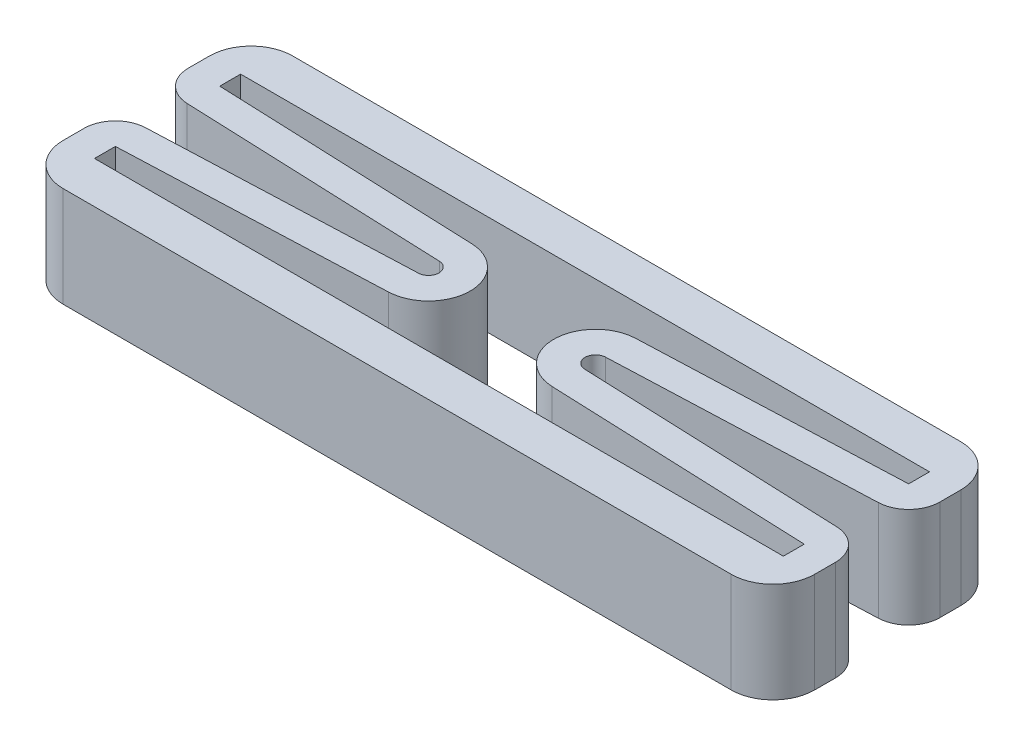
ISO-10303-21;
HEADER;
FILE_DESCRIPTION(('STEP AP214'),'2;1');
FILE_NAME('part.step','',(''),(''),'','','');
FILE_SCHEMA(('AUTOMOTIVE_DESIGN { 1 0 10303 214 1 1 1 1 }'));
ENDSEC;
DATA;
#1=APPLICATION_CONTEXT('core data for automotive mechanical design processes');
#2=APPLICATION_PROTOCOL_DEFINITION('international standard','automotive_design',2000,#1);
#3=PRODUCT_CONTEXT('',#1,'mechanical');
#4=PRODUCT('Part','Part','',(#3));
#5=PRODUCT_RELATED_PRODUCT_CATEGORY('part','',(#4));
#6=PRODUCT_DEFINITION_FORMATION('','',#4);
#7=PRODUCT_DEFINITION_CONTEXT('part definition',#1,'design');
#8=PRODUCT_DEFINITION('design','',#6,#7);
#9=PRODUCT_DEFINITION_SHAPE('','',#8);
#10=(LENGTH_UNIT() NAMED_UNIT(*) SI_UNIT(.MILLI.,.METRE.));
#11=(NAMED_UNIT(*) PLANE_ANGLE_UNIT() SI_UNIT($,.RADIAN.));
#12=(NAMED_UNIT(*) SI_UNIT($,.STERADIAN.) SOLID_ANGLE_UNIT());
#13=UNCERTAINTY_MEASURE_WITH_UNIT(LENGTH_MEASURE(1.E-05),#10,'distance_accuracy_value','');
#14=(GEOMETRIC_REPRESENTATION_CONTEXT(3) GLOBAL_UNCERTAINTY_ASSIGNED_CONTEXT((#13)) GLOBAL_UNIT_ASSIGNED_CONTEXT((#10,
#11,#12)) REPRESENTATION_CONTEXT('',''));
#15=CARTESIAN_POINT('',(0.,0.,0.));
#16=DIRECTION('',(0.,0.,1.));
#17=DIRECTION('',(1.,0.,0.));
#18=AXIS2_PLACEMENT_3D('',#15,#16,#17);
#19=CARTESIAN_POINT('',(16.5,4.8,-2.5));
#20=DIRECTION('',(0.,1.,0.));
#21=DIRECTION('',(0.,0.,1.));
#22=AXIS2_PLACEMENT_3D('',#19,#20,#21);
#23=PLANE('',#22);
#24=CARTESIAN_POINT('',(16.5,4.8,-2.5));
#25=DIRECTION('',(0.,1.,0.));
#26=DIRECTION('',(0.,0.,1.));
#27=AXIS2_PLACEMENT_3D('',#24,#25,#26);
#28=CIRCLE('',#27,1.5);
#29=CARTESIAN_POINT('',(16.5597618072003,4.8,-1.00119096399837));
#30=VERTEX_POINT('',#29);
#31=CARTESIAN_POINT('',(18.,4.8,-2.5));
#32=VERTEX_POINT('',#31);
#33=EDGE_CURVE('E384',#30,#32,#28,.T.);
#34=ORIENTED_EDGE('',*,*,#33,.T.);
#35=DIRECTION('',(0.,0.,-1.));
#36=VECTOR('',#35,1.);
#37=CARTESIAN_POINT('',(18.,4.8,-3.5));
#38=LINE('',#37,#36);
#39=CARTESIAN_POINT('',(18.,4.8,-3.5));
#40=VERTEX_POINT('',#39);
#41=EDGE_CURVE('E388',#32,#40,#38,.T.);
#42=ORIENTED_EDGE('',*,*,#41,.T.);
#43=CARTESIAN_POINT('',(16.,4.8,-3.5));
#44=DIRECTION('',(0.,1.,0.));
#45=DIRECTION('',(0.,0.,-1.));
#46=AXIS2_PLACEMENT_3D('',#43,#44,#45);
#47=CIRCLE('',#46,2.);
#48=CARTESIAN_POINT('',(16.,4.8,-5.5));
#49=VERTEX_POINT('',#48);
#50=EDGE_CURVE('E392',#40,#49,#47,.T.);
#51=ORIENTED_EDGE('',*,*,#50,.T.);
#52=DIRECTION('',(-1.,0.,0.));
#53=VECTOR('',#52,1.);
#54=CARTESIAN_POINT('',(-16.,4.8,-5.49999999999999));
#55=LINE('',#54,#53);
#56=CARTESIAN_POINT('',(-16.,4.8,-5.49999999999999));
#57=VERTEX_POINT('',#56);
#58=EDGE_CURVE('E395',#49,#57,#55,.T.);
#59=ORIENTED_EDGE('',*,*,#58,.T.);
#60=CARTESIAN_POINT('',(-16.,4.8,-3.5));
#61=DIRECTION('',(0.,1.,0.));
#62=DIRECTION('',(0.,0.,1.));
#63=AXIS2_PLACEMENT_3D('',#60,#61,#62);
#64=CIRCLE('',#63,2.);
#65=CARTESIAN_POINT('',(-18.,4.8,-3.5));
#66=VERTEX_POINT('',#65);
#67=EDGE_CURVE('E398',#57,#66,#64,.T.);
#68=ORIENTED_EDGE('',*,*,#67,.T.);
#69=DIRECTION('',(0.,0.,1.));
#70=VECTOR('',#69,1.);
#71=CARTESIAN_POINT('',(-18.,4.8,-3.5));
#72=LINE('',#71,#70);
#73=CARTESIAN_POINT('',(-18.,4.8,-2.5));
#74=VERTEX_POINT('',#73);
#75=EDGE_CURVE('E401',#66,#74,#72,.T.);
#76=ORIENTED_EDGE('',*,*,#75,.T.);
#77=CARTESIAN_POINT('',(-16.5,4.8,-2.5));
#78=DIRECTION('',(0.,1.,0.));
#79=DIRECTION('',(0.,0.,-1.));
#80=AXIS2_PLACEMENT_3D('',#77,#78,#79);
#81=CIRCLE('',#80,1.5);
#82=CARTESIAN_POINT('',(-16.5597618072003,4.8,-1.00119096399836));
#83=VERTEX_POINT('',#82);
#84=EDGE_CURVE('E404',#74,#83,#81,.T.);
#85=ORIENTED_EDGE('',*,*,#84,.T.);
#86=DIRECTION('',(0.99920602400109,0.,0.039841204800218));
#87=VECTOR('',#86,1.);
#88=CARTESIAN_POINT('',(-3.98007939759989,4.8,-0.499603012000543));
#89=LINE('',#88,#87);
#90=CARTESIAN_POINT('',(-3.98007939759989,4.8,-0.499603012000543));
#91=VERTEX_POINT('',#90);
#92=EDGE_CURVE('E407',#83,#91,#89,.T.);
#93=ORIENTED_EDGE('',*,*,#92,.T.);
#94=CARTESIAN_POINT('',(-4.,4.8,0.));
#95=DIRECTION('',(0.,-1.,0.));
#96=DIRECTION('',(0.,0.,-1.));
#97=AXIS2_PLACEMENT_3D('',#94,#95,#96);
#98=CIRCLE('',#97,0.5);
#99=CARTESIAN_POINT('',(-3.98007939759988,4.8,0.499603012000547));
#100=VERTEX_POINT('',#99);
#101=EDGE_CURVE('E410',#91,#100,#98,.T.);
#102=ORIENTED_EDGE('',*,*,#101,.T.);
#103=DIRECTION('',(-0.99920602400109,0.,0.0398412048002182));
#104=VECTOR('',#103,1.);
#105=CARTESIAN_POINT('',(-3.98007939759988,4.8,0.499603012000547));
#106=LINE('',#105,#104);
#107=CARTESIAN_POINT('',(-16.5597618072003,4.8,1.00119096399837));
#108=VERTEX_POINT('',#107);
#109=EDGE_CURVE('E413',#100,#108,#106,.T.);
#110=ORIENTED_EDGE('',*,*,#109,.T.);
#111=CARTESIAN_POINT('',(-16.5,4.8,2.5));
#112=DIRECTION('',(0.,1.,0.));
#113=DIRECTION('',(0.,0.,1.));
#114=AXIS2_PLACEMENT_3D('',#111,#112,#113);
#115=CIRCLE('',#114,1.5);
#116=CARTESIAN_POINT('',(-18.,4.8,2.5));
#117=VERTEX_POINT('',#116);
#118=EDGE_CURVE('E416',#108,#117,#115,.T.);
#119=ORIENTED_EDGE('',*,*,#118,.T.);
#120=DIRECTION('',(0.,0.,1.));
#121=VECTOR('',#120,1.);
#122=CARTESIAN_POINT('',(-18.,4.8,3.5));
#123=LINE('',#122,#121);
#124=CARTESIAN_POINT('',(-18.,4.8,3.5));
#125=VERTEX_POINT('',#124);
#126=EDGE_CURVE('E419',#117,#125,#123,.T.);
#127=ORIENTED_EDGE('',*,*,#126,.T.);
#128=CARTESIAN_POINT('',(-16.,4.8,3.5));
#129=DIRECTION('',(0.,1.,0.));
#130=DIRECTION('',(0.,0.,-1.));
#131=AXIS2_PLACEMENT_3D('',#128,#129,#130);
#132=CIRCLE('',#131,2.);
#133=CARTESIAN_POINT('',(-16.,4.8,5.5));
#134=VERTEX_POINT('',#133);
#135=EDGE_CURVE('E422',#125,#134,#132,.T.);
#136=ORIENTED_EDGE('',*,*,#135,.T.);
#137=DIRECTION('',(1.,0.,0.));
#138=VECTOR('',#137,1.);
#139=CARTESIAN_POINT('',(-16.,4.8,5.5));
#140=LINE('',#139,#138);
#141=CARTESIAN_POINT('',(16.,4.8,5.5));
#142=VERTEX_POINT('',#141);
#143=EDGE_CURVE('E425',#134,#142,#140,.T.);
#144=ORIENTED_EDGE('',*,*,#143,.T.);
#145=CARTESIAN_POINT('',(16.,4.8,3.5));
#146=DIRECTION('',(0.,1.,0.));
#147=DIRECTION('',(0.,0.,1.));
#148=AXIS2_PLACEMENT_3D('',#145,#146,#147);
#149=CIRCLE('',#148,2.);
#150=CARTESIAN_POINT('',(18.,4.8,3.5));
#151=VERTEX_POINT('',#150);
#152=EDGE_CURVE('E428',#142,#151,#149,.T.);
#153=ORIENTED_EDGE('',*,*,#152,.T.);
#154=DIRECTION('',(0.,0.,-1.));
#155=VECTOR('',#154,1.);
#156=CARTESIAN_POINT('',(18.,4.8,3.5));
#157=LINE('',#156,#155);
#158=CARTESIAN_POINT('',(18.,4.8,2.5));
#159=VERTEX_POINT('',#158);
#160=EDGE_CURVE('E431',#151,#159,#157,.T.);
#161=ORIENTED_EDGE('',*,*,#160,.T.);
#162=CARTESIAN_POINT('',(16.5,4.8,2.5));
#163=DIRECTION('',(0.,1.,0.));
#164=DIRECTION('',(0.,0.,-1.));
#165=AXIS2_PLACEMENT_3D('',#162,#163,#164);
#166=CIRCLE('',#165,1.5);
#167=CARTESIAN_POINT('',(16.5597618072003,4.8,1.00119096399837));
#168=VERTEX_POINT('',#167);
#169=EDGE_CURVE('E434',#159,#168,#166,.T.);
#170=ORIENTED_EDGE('',*,*,#169,.T.);
#171=DIRECTION('',(-0.99920602400109,0.,-0.0398412048002182));
#172=VECTOR('',#171,1.);
#173=CARTESIAN_POINT('',(3.98007939759988,4.8,0.499603012000545));
#174=LINE('',#173,#172);
#175=CARTESIAN_POINT('',(3.98007939759988,4.8,0.499603012000545));
#176=VERTEX_POINT('',#175);
#177=EDGE_CURVE('E437',#168,#176,#174,.T.);
#178=ORIENTED_EDGE('',*,*,#177,.T.);
#179=CARTESIAN_POINT('',(4.,4.8,0.));
#180=DIRECTION('',(0.,-1.,0.));
#181=DIRECTION('',(0.,0.,1.));
#182=AXIS2_PLACEMENT_3D('',#179,#180,#181);
#183=CIRCLE('',#182,0.5);
#184=CARTESIAN_POINT('',(3.98007939759989,4.8,-0.499603012000545));
#185=VERTEX_POINT('',#184);
#186=EDGE_CURVE('E440',#176,#185,#183,.T.);
#187=ORIENTED_EDGE('',*,*,#186,.T.);
#188=DIRECTION('',(0.99920602400109,0.,-0.0398412048002182));
#189=VECTOR('',#188,1.);
#190=CARTESIAN_POINT('',(3.98007939759989,4.8,-0.499603012000545));
#191=LINE('',#190,#189);
#192=EDGE_CURVE('E443',#185,#30,#191,.T.);
#193=ORIENTED_EDGE('',*,*,#192,.T.);
#194=EDGE_LOOP('',(#34,#42,#51,#59,#68,#76,#85,#93,#102,#110,#119,#127,#136,#144,#153,#161,#170,
#178,#187,#193));
#195=FACE_BOUND('',#194,.T.);
#196=DIRECTION('',(-1.,0.,0.));
#197=VECTOR('',#196,1.);
#198=CARTESIAN_POINT('',(16.5,4.8,-3.5));
#199=LINE('',#198,#197);
#200=CARTESIAN_POINT('',(16.5,4.8,-3.5));
#201=VERTEX_POINT('',#200);
#202=CARTESIAN_POINT('',(-16.5,4.8,-3.5));
#203=VERTEX_POINT('',#202);
#204=EDGE_CURVE('E264',#201,#203,#199,.T.);
#205=ORIENTED_EDGE('',*,*,#204,.F.);
#206=DIRECTION('',(0.,0.,-1.));
#207=VECTOR('',#206,1.);
#208=CARTESIAN_POINT('',(16.5,4.8,-3.5));
#209=LINE('',#208,#207);
#210=CARTESIAN_POINT('',(16.5,4.8,-2.5));
#211=VERTEX_POINT('',#210);
#212=EDGE_CURVE('E255',#211,#201,#209,.T.);
#213=ORIENTED_EDGE('',*,*,#212,.F.);
#214=DIRECTION('',(0.99920602400109,0.,-0.039841204800218));
#215=VECTOR('',#214,1.);
#216=CARTESIAN_POINT('',(16.5,4.8,-2.5));
#217=LINE('',#216,#215);
#218=CARTESIAN_POINT('',(3.92031759039957,4.8,-1.99841204800218));
#219=VERTEX_POINT('',#218);
#220=EDGE_CURVE('E308',#219,#211,#217,.T.);
#221=ORIENTED_EDGE('',*,*,#220,.F.);
#222=CARTESIAN_POINT('',(4.,4.8,0.));
#223=DIRECTION('',(0.,-1.,0.));
#224=DIRECTION('',(0.,0.,1.));
#225=AXIS2_PLACEMENT_3D('',#222,#223,#224);
#226=CIRCLE('',#225,2.);
#227=CARTESIAN_POINT('',(3.92031759039956,4.8,1.99841204800218));
#228=VERTEX_POINT('',#227);
#229=EDGE_CURVE('E305',#228,#219,#226,.T.);
#230=ORIENTED_EDGE('',*,*,#229,.F.);
#231=DIRECTION('',(-0.99920602400109,0.,-0.039841204800218));
#232=VECTOR('',#231,1.);
#233=CARTESIAN_POINT('',(16.5,4.8,2.5));
#234=LINE('',#233,#232);
#235=CARTESIAN_POINT('',(16.5,4.8,2.5));
#236=VERTEX_POINT('',#235);
#237=EDGE_CURVE('E302',#236,#228,#234,.T.);
#238=ORIENTED_EDGE('',*,*,#237,.F.);
#239=DIRECTION('',(0.,0.,-1.));
#240=VECTOR('',#239,1.);
#241=CARTESIAN_POINT('',(16.5,4.8,3.5));
#242=LINE('',#241,#240);
#243=CARTESIAN_POINT('',(16.5,4.8,3.5));
#244=VERTEX_POINT('',#243);
#245=EDGE_CURVE('E299',#244,#236,#242,.T.);
#246=ORIENTED_EDGE('',*,*,#245,.F.);
#247=DIRECTION('',(1.,0.,0.));
#248=VECTOR('',#247,1.);
#249=CARTESIAN_POINT('',(16.5,4.8,3.5));
#250=LINE('',#249,#248);
#251=CARTESIAN_POINT('',(-16.5,4.8,3.5));
#252=VERTEX_POINT('',#251);
#253=EDGE_CURVE('E296',#252,#244,#250,.T.);
#254=ORIENTED_EDGE('',*,*,#253,.F.);
#255=DIRECTION('',(0.,0.,1.));
#256=VECTOR('',#255,1.);
#257=CARTESIAN_POINT('',(-16.5,4.8,3.5));
#258=LINE('',#257,#256);
#259=CARTESIAN_POINT('',(-16.5,4.8,2.5));
#260=VERTEX_POINT('',#259);
#261=EDGE_CURVE('E293',#260,#252,#258,.T.);
#262=ORIENTED_EDGE('',*,*,#261,.F.);
#263=DIRECTION('',(-0.99920602400109,0.,0.039841204800218));
#264=VECTOR('',#263,1.);
#265=CARTESIAN_POINT('',(-16.5,4.8,2.5));
#266=LINE('',#265,#264);
#267=CARTESIAN_POINT('',(-3.92031759039956,4.8,1.99841204800218));
#268=VERTEX_POINT('',#267);
#269=EDGE_CURVE('E290',#268,#260,#266,.T.);
#270=ORIENTED_EDGE('',*,*,#269,.F.);
#271=CARTESIAN_POINT('',(-4.,4.8,0.));
#272=DIRECTION('',(0.,-1.,0.));
#273=DIRECTION('',(0.,0.,-1.));
#274=AXIS2_PLACEMENT_3D('',#271,#272,#273);
#275=CIRCLE('',#274,2.);
#276=CARTESIAN_POINT('',(-3.92031759039956,4.8,-1.99841204800218));
#277=VERTEX_POINT('',#276);
#278=EDGE_CURVE('E287',#277,#268,#275,.T.);
#279=ORIENTED_EDGE('',*,*,#278,.F.);
#280=DIRECTION('',(0.99920602400109,0.,0.039841204800218));
#281=VECTOR('',#280,1.);
#282=CARTESIAN_POINT('',(-16.5,4.8,-2.5));
#283=LINE('',#282,#281);
#284=CARTESIAN_POINT('',(-16.5,4.8,-2.5));
#285=VERTEX_POINT('',#284);
#286=EDGE_CURVE('E282',#285,#277,#283,.T.);
#287=ORIENTED_EDGE('',*,*,#286,.F.);
#288=DIRECTION('',(0.,0.,1.));
#289=VECTOR('',#288,1.);
#290=CARTESIAN_POINT('',(-16.5,4.8,-3.5));
#291=LINE('',#290,#289);
#292=EDGE_CURVE('E278',#203,#285,#291,.T.);
#293=ORIENTED_EDGE('',*,*,#292,.F.);
#294=EDGE_LOOP('',(#205,#213,#221,#230,#238,#246,#254,#262,#270,#279,#287,#293));
#295=FACE_BOUND('',#294,.T.);
#296=ADVANCED_FACE('F45',(#195,#295),#23,.T.);
#297=CARTESIAN_POINT('',(16.5,0.,-2.5));
#298=DIRECTION('',(0.,1.,0.));
#299=DIRECTION('',(0.,0.,1.));
#300=AXIS2_PLACEMENT_3D('',#297,#298,#299);
#301=PLANE('',#300);
#302=CARTESIAN_POINT('',(16.5,0.,-2.5));
#303=DIRECTION('',(0.,1.,0.));
#304=DIRECTION('',(0.,0.,1.));
#305=AXIS2_PLACEMENT_3D('',#302,#303,#304);
#306=CIRCLE('',#305,1.5);
#307=CARTESIAN_POINT('',(16.5597618072003,0.,-1.00119096399837));
#308=VERTEX_POINT('',#307);
#309=CARTESIAN_POINT('',(18.,0.,-2.5));
#310=VERTEX_POINT('',#309);
#311=EDGE_CURVE('E273',#308,#310,#306,.T.);
#312=ORIENTED_EDGE('',*,*,#311,.F.);
#313=DIRECTION('',(0.99920602400109,0.,-0.0398412048002182));
#314=VECTOR('',#313,1.);
#315=CARTESIAN_POINT('',(3.98007939759989,0.,-0.499603012000545));
#316=LINE('',#315,#314);
#317=CARTESIAN_POINT('',(3.98007939759989,0.,-0.499603012000545));
#318=VERTEX_POINT('',#317);
#319=EDGE_CURVE('E389',#318,#308,#316,.T.);
#320=ORIENTED_EDGE('',*,*,#319,.F.);
#321=CARTESIAN_POINT('',(4.,0.,0.));
#322=DIRECTION('',(0.,-1.,0.));
#323=DIRECTION('',(0.,0.,1.));
#324=AXIS2_PLACEMENT_3D('',#321,#322,#323);
#325=CIRCLE('',#324,0.5);
#326=CARTESIAN_POINT('',(3.98007939759988,0.,0.499603012000545));
#327=VERTEX_POINT('',#326);
#328=EDGE_CURVE('E501',#327,#318,#325,.T.);
#329=ORIENTED_EDGE('',*,*,#328,.F.);
#330=DIRECTION('',(-0.99920602400109,0.,-0.0398412048002182));
#331=VECTOR('',#330,1.);
#332=CARTESIAN_POINT('',(3.98007939759988,0.,0.499603012000545));
#333=LINE('',#332,#331);
#334=CARTESIAN_POINT('',(16.5597618072003,0.,1.00119096399837));
#335=VERTEX_POINT('',#334);
#336=EDGE_CURVE('E498',#335,#327,#333,.T.);
#337=ORIENTED_EDGE('',*,*,#336,.F.);
#338=CARTESIAN_POINT('',(16.5,0.,2.5));
#339=DIRECTION('',(0.,1.,0.));
#340=DIRECTION('',(0.,0.,-1.));
#341=AXIS2_PLACEMENT_3D('',#338,#339,#340);
#342=CIRCLE('',#341,1.5);
#343=CARTESIAN_POINT('',(18.,0.,2.5));
#344=VERTEX_POINT('',#343);
#345=EDGE_CURVE('E495',#344,#335,#342,.T.);
#346=ORIENTED_EDGE('',*,*,#345,.F.);
#347=DIRECTION('',(0.,0.,-1.));
#348=VECTOR('',#347,1.);
#349=CARTESIAN_POINT('',(18.,0.,3.5));
#350=LINE('',#349,#348);
#351=CARTESIAN_POINT('',(18.,0.,3.5));
#352=VERTEX_POINT('',#351);
#353=EDGE_CURVE('E492',#352,#344,#350,.T.);
#354=ORIENTED_EDGE('',*,*,#353,.F.);
#355=CARTESIAN_POINT('',(16.,0.,3.5));
#356=DIRECTION('',(0.,1.,0.));
#357=DIRECTION('',(0.,0.,1.));
#358=AXIS2_PLACEMENT_3D('',#355,#356,#357);
#359=CIRCLE('',#358,2.);
#360=CARTESIAN_POINT('',(16.,0.,5.5));
#361=VERTEX_POINT('',#360);
#362=EDGE_CURVE('E489',#361,#352,#359,.T.);
#363=ORIENTED_EDGE('',*,*,#362,.F.);
#364=DIRECTION('',(1.,0.,0.));
#365=VECTOR('',#364,1.);
#366=CARTESIAN_POINT('',(-16.,0.,5.5));
#367=LINE('',#366,#365);
#368=CARTESIAN_POINT('',(-16.,0.,5.5));
#369=VERTEX_POINT('',#368);
#370=EDGE_CURVE('E486',#369,#361,#367,.T.);
#371=ORIENTED_EDGE('',*,*,#370,.F.);
#372=CARTESIAN_POINT('',(-16.,0.,3.5));
#373=DIRECTION('',(0.,1.,0.));
#374=DIRECTION('',(0.,0.,-1.));
#375=AXIS2_PLACEMENT_3D('',#372,#373,#374);
#376=CIRCLE('',#375,2.);
#377=CARTESIAN_POINT('',(-18.,0.,3.5));
#378=VERTEX_POINT('',#377);
#379=EDGE_CURVE('E483',#378,#369,#376,.T.);
#380=ORIENTED_EDGE('',*,*,#379,.F.);
#381=DIRECTION('',(0.,0.,1.));
#382=VECTOR('',#381,1.);
#383=CARTESIAN_POINT('',(-18.,0.,3.5));
#384=LINE('',#383,#382);
#385=CARTESIAN_POINT('',(-18.,0.,2.5));
#386=VERTEX_POINT('',#385);
#387=EDGE_CURVE('E480',#386,#378,#384,.T.);
#388=ORIENTED_EDGE('',*,*,#387,.F.);
#389=CARTESIAN_POINT('',(-16.5,0.,2.5));
#390=DIRECTION('',(0.,1.,0.));
#391=DIRECTION('',(0.,0.,1.));
#392=AXIS2_PLACEMENT_3D('',#389,#390,#391);
#393=CIRCLE('',#392,1.5);
#394=CARTESIAN_POINT('',(-16.5597618072003,0.,1.00119096399837));
#395=VERTEX_POINT('',#394);
#396=EDGE_CURVE('E477',#395,#386,#393,.T.);
#397=ORIENTED_EDGE('',*,*,#396,.F.);
#398=DIRECTION('',(-0.99920602400109,0.,0.0398412048002182));
#399=VECTOR('',#398,1.);
#400=CARTESIAN_POINT('',(-3.98007939759988,0.,0.499603012000547));
#401=LINE('',#400,#399);
#402=CARTESIAN_POINT('',(-3.98007939759988,0.,0.499603012000547));
#403=VERTEX_POINT('',#402);
#404=EDGE_CURVE('E474',#403,#395,#401,.T.);
#405=ORIENTED_EDGE('',*,*,#404,.F.);
#406=CARTESIAN_POINT('',(-4.,0.,0.));
#407=DIRECTION('',(0.,-1.,0.));
#408=DIRECTION('',(0.,0.,-1.));
#409=AXIS2_PLACEMENT_3D('',#406,#407,#408);
#410=CIRCLE('',#409,0.5);
#411=CARTESIAN_POINT('',(-3.98007939759989,0.,-0.499603012000543));
#412=VERTEX_POINT('',#411);
#413=EDGE_CURVE('E471',#412,#403,#410,.T.);
#414=ORIENTED_EDGE('',*,*,#413,.F.);
#415=DIRECTION('',(0.99920602400109,0.,0.039841204800218));
#416=VECTOR('',#415,1.);
#417=CARTESIAN_POINT('',(-3.98007939759989,0.,-0.499603012000543));
#418=LINE('',#417,#416);
#419=CARTESIAN_POINT('',(-16.5597618072003,0.,-1.00119096399836));
#420=VERTEX_POINT('',#419);
#421=EDGE_CURVE('E468',#420,#412,#418,.T.);
#422=ORIENTED_EDGE('',*,*,#421,.F.);
#423=CARTESIAN_POINT('',(-16.5,0.,-2.5));
#424=DIRECTION('',(0.,1.,0.));
#425=DIRECTION('',(0.,0.,-1.));
#426=AXIS2_PLACEMENT_3D('',#423,#424,#425);
#427=CIRCLE('',#426,1.5);
#428=CARTESIAN_POINT('',(-18.,0.,-2.5));
#429=VERTEX_POINT('',#428);
#430=EDGE_CURVE('E465',#429,#420,#427,.T.);
#431=ORIENTED_EDGE('',*,*,#430,.F.);
#432=DIRECTION('',(0.,0.,1.));
#433=VECTOR('',#432,1.);
#434=CARTESIAN_POINT('',(-18.,0.,-3.5));
#435=LINE('',#434,#433);
#436=CARTESIAN_POINT('',(-18.,0.,-3.5));
#437=VERTEX_POINT('',#436);
#438=EDGE_CURVE('E462',#437,#429,#435,.T.);
#439=ORIENTED_EDGE('',*,*,#438,.F.);
#440=CARTESIAN_POINT('',(-16.,0.,-3.5));
#441=DIRECTION('',(0.,1.,0.));
#442=DIRECTION('',(0.,0.,1.));
#443=AXIS2_PLACEMENT_3D('',#440,#441,#442);
#444=CIRCLE('',#443,2.);
#445=CARTESIAN_POINT('',(-16.,0.,-5.49999999999999));
#446=VERTEX_POINT('',#445);
#447=EDGE_CURVE('E459',#446,#437,#444,.T.);
#448=ORIENTED_EDGE('',*,*,#447,.F.);
#449=DIRECTION('',(-1.,0.,0.));
#450=VECTOR('',#449,1.);
#451=CARTESIAN_POINT('',(-16.,0.,-5.49999999999999));
#452=LINE('',#451,#450);
#453=CARTESIAN_POINT('',(16.,0.,-5.5));
#454=VERTEX_POINT('',#453);
#455=EDGE_CURVE('E456',#454,#446,#452,.T.);
#456=ORIENTED_EDGE('',*,*,#455,.F.);
#457=CARTESIAN_POINT('',(16.,0.,-3.5));
#458=DIRECTION('',(0.,1.,0.));
#459=DIRECTION('',(0.,0.,-1.));
#460=AXIS2_PLACEMENT_3D('',#457,#458,#459);
#461=CIRCLE('',#460,2.);
#462=CARTESIAN_POINT('',(18.,0.,-3.5));
#463=VERTEX_POINT('',#462);
#464=EDGE_CURVE('E453',#463,#454,#461,.T.);
#465=ORIENTED_EDGE('',*,*,#464,.F.);
#466=DIRECTION('',(0.,0.,-1.));
#467=VECTOR('',#466,1.);
#468=CARTESIAN_POINT('',(18.,0.,-3.5));
#469=LINE('',#468,#467);
#470=EDGE_CURVE('E450',#310,#463,#469,.T.);
#471=ORIENTED_EDGE('',*,*,#470,.F.);
#472=EDGE_LOOP('',(#312,#320,#329,#337,#346,#354,#363,#371,#380,#388,#397,#405,#414,#422,#431,
#439,#448,#456,#465,#471));
#473=FACE_BOUND('',#472,.T.);
#474=DIRECTION('',(0.,0.,-1.));
#475=VECTOR('',#474,1.);
#476=CARTESIAN_POINT('',(16.5,0.,-3.5));
#477=LINE('',#476,#475);
#478=CARTESIAN_POINT('',(16.5,0.,-2.5));
#479=VERTEX_POINT('',#478);
#480=CARTESIAN_POINT('',(16.5,0.,-3.5));
#481=VERTEX_POINT('',#480);
#482=EDGE_CURVE('E69',#479,#481,#477,.T.);
#483=ORIENTED_EDGE('',*,*,#482,.T.);
#484=DIRECTION('',(-1.,0.,0.));
#485=VECTOR('',#484,1.);
#486=CARTESIAN_POINT('',(16.5,0.,-3.5));
#487=LINE('',#486,#485);
#488=CARTESIAN_POINT('',(-16.5,0.,-3.5));
#489=VERTEX_POINT('',#488);
#490=EDGE_CURVE('E271',#481,#489,#487,.T.);
#491=ORIENTED_EDGE('',*,*,#490,.T.);
#492=DIRECTION('',(0.,0.,1.));
#493=VECTOR('',#492,1.);
#494=CARTESIAN_POINT('',(-16.5,0.,-3.5));
#495=LINE('',#494,#493);
#496=CARTESIAN_POINT('',(-16.5,0.,-2.5));
#497=VERTEX_POINT('',#496);
#498=EDGE_CURVE('E315',#489,#497,#495,.T.);
#499=ORIENTED_EDGE('',*,*,#498,.T.);
#500=DIRECTION('',(0.99920602400109,0.,0.039841204800218));
#501=VECTOR('',#500,1.);
#502=CARTESIAN_POINT('',(-16.5,0.,-2.5));
#503=LINE('',#502,#501);
#504=CARTESIAN_POINT('',(-3.92031759039956,0.,-1.99841204800218));
#505=VERTEX_POINT('',#504);
#506=EDGE_CURVE('E319',#497,#505,#503,.T.);
#507=ORIENTED_EDGE('',*,*,#506,.T.);
#508=CARTESIAN_POINT('',(-4.,0.,0.));
#509=DIRECTION('',(0.,-1.,0.));
#510=DIRECTION('',(0.,0.,-1.));
#511=AXIS2_PLACEMENT_3D('',#508,#509,#510);
#512=CIRCLE('',#511,2.);
#513=CARTESIAN_POINT('',(-3.92031759039956,0.,1.99841204800218));
#514=VERTEX_POINT('',#513);
#515=EDGE_CURVE('E323',#505,#514,#512,.T.);
#516=ORIENTED_EDGE('',*,*,#515,.T.);
#517=DIRECTION('',(-0.99920602400109,0.,0.039841204800218));
#518=VECTOR('',#517,1.);
#519=CARTESIAN_POINT('',(-16.5,0.,2.5));
#520=LINE('',#519,#518);
#521=CARTESIAN_POINT('',(-16.5,0.,2.5));
#522=VERTEX_POINT('',#521);
#523=EDGE_CURVE('E327',#514,#522,#520,.T.);
#524=ORIENTED_EDGE('',*,*,#523,.T.);
#525=DIRECTION('',(0.,0.,1.));
#526=VECTOR('',#525,1.);
#527=CARTESIAN_POINT('',(-16.5,0.,3.5));
#528=LINE('',#527,#526);
#529=CARTESIAN_POINT('',(-16.5,0.,3.5));
#530=VERTEX_POINT('',#529);
#531=EDGE_CURVE('E331',#522,#530,#528,.T.);
#532=ORIENTED_EDGE('',*,*,#531,.T.);
#533=DIRECTION('',(1.,0.,0.));
#534=VECTOR('',#533,1.);
#535=CARTESIAN_POINT('',(16.5,0.,3.5));
#536=LINE('',#535,#534);
#537=CARTESIAN_POINT('',(16.5,0.,3.5));
#538=VERTEX_POINT('',#537);
#539=EDGE_CURVE('E335',#530,#538,#536,.T.);
#540=ORIENTED_EDGE('',*,*,#539,.T.);
#541=DIRECTION('',(0.,0.,-1.));
#542=VECTOR('',#541,1.);
#543=CARTESIAN_POINT('',(16.5,0.,3.5));
#544=LINE('',#543,#542);
#545=CARTESIAN_POINT('',(16.5,0.,2.5));
#546=VERTEX_POINT('',#545);
#547=EDGE_CURVE('E339',#538,#546,#544,.T.);
#548=ORIENTED_EDGE('',*,*,#547,.T.);
#549=DIRECTION('',(-0.99920602400109,0.,-0.039841204800218));
#550=VECTOR('',#549,1.);
#551=CARTESIAN_POINT('',(16.5,0.,2.5));
#552=LINE('',#551,#550);
#553=CARTESIAN_POINT('',(3.92031759039956,0.,1.99841204800218));
#554=VERTEX_POINT('',#553);
#555=EDGE_CURVE('E343',#546,#554,#552,.T.);
#556=ORIENTED_EDGE('',*,*,#555,.T.);
#557=CARTESIAN_POINT('',(4.,0.,0.));
#558=DIRECTION('',(0.,-1.,0.));
#559=DIRECTION('',(0.,0.,1.));
#560=AXIS2_PLACEMENT_3D('',#557,#558,#559);
#561=CIRCLE('',#560,2.);
#562=CARTESIAN_POINT('',(3.92031759039956,0.,-1.99841204800218));
#563=VERTEX_POINT('',#562);
#564=EDGE_CURVE('E347',#554,#563,#561,.T.);
#565=ORIENTED_EDGE('',*,*,#564,.T.);
#566=DIRECTION('',(0.99920602400109,0.,-0.039841204800218));
#567=VECTOR('',#566,1.);
#568=CARTESIAN_POINT('',(16.5,0.,-2.5));
#569=LINE('',#568,#567);
#570=EDGE_CURVE('E265',#563,#479,#569,.T.);
#571=ORIENTED_EDGE('',*,*,#570,.T.);
#572=EDGE_LOOP('',(#483,#491,#499,#507,#516,#524,#532,#540,#548,#556,#565,#571));
#573=FACE_BOUND('',#572,.T.);
#574=ADVANCED_FACE('F588',(#473,#573),#301,.F.);
#575=CARTESIAN_POINT('',(16.5,4.8,-2.5));
#576=DIRECTION('',(0.,-1.,0.));
#577=DIRECTION('',(0.,0.,-1.));
#578=AXIS2_PLACEMENT_3D('',#575,#576,#577);
#579=CYLINDRICAL_SURFACE('',#578,1.5);
#580=ORIENTED_EDGE('',*,*,#311,.T.);
#581=DIRECTION('',(0.,-1.,0.));
#582=VECTOR('',#581,1.);
#583=CARTESIAN_POINT('',(18.,4.8,-2.5));
#584=LINE('',#583,#582);
#585=EDGE_CURVE('E11',#32,#310,#584,.T.);
#586=ORIENTED_EDGE('',*,*,#585,.F.);
#587=ORIENTED_EDGE('',*,*,#33,.F.);
#588=DIRECTION('',(0.,-1.,0.));
#589=VECTOR('',#588,1.);
#590=CARTESIAN_POINT('',(16.5597618072003,4.8,-1.00119096399837));
#591=LINE('',#590,#589);
#592=EDGE_CURVE('E446',#30,#308,#591,.T.);
#593=ORIENTED_EDGE('',*,*,#592,.T.);
#594=EDGE_LOOP('',(#580,#586,#587,#593));
#595=FACE_BOUND('',#594,.T.);
#596=ADVANCED_FACE('F47',(#595),#579,.T.);
#597=CARTESIAN_POINT('',(18.,4.8,-3.5));
#598=DIRECTION('',(-1.,0.,0.));
#599=DIRECTION('',(0.,0.,1.));
#600=AXIS2_PLACEMENT_3D('',#597,#598,#599);
#601=PLANE('',#600);
#602=ORIENTED_EDGE('',*,*,#470,.T.);
#603=DIRECTION('',(0.,-1.,0.));
#604=VECTOR('',#603,1.);
#605=CARTESIAN_POINT('',(18.,4.8,-3.5));
#606=LINE('',#605,#604);
#607=EDGE_CURVE('E54',#40,#463,#606,.T.);
#608=ORIENTED_EDGE('',*,*,#607,.F.);
#609=ORIENTED_EDGE('',*,*,#41,.F.);
#610=ORIENTED_EDGE('',*,*,#585,.T.);
#611=EDGE_LOOP('',(#602,#608,#609,#610));
#612=FACE_BOUND('',#611,.T.);
#613=ADVANCED_FACE('F605',(#612),#601,.F.);
#614=CARTESIAN_POINT('',(16.,4.8,-3.5));
#615=DIRECTION('',(0.,-1.,0.));
#616=DIRECTION('',(0.,0.,-1.));
#617=AXIS2_PLACEMENT_3D('',#614,#615,#616);
#618=CYLINDRICAL_SURFACE('',#617,2.);
#619=ORIENTED_EDGE('',*,*,#464,.T.);
#620=DIRECTION('',(0.,-1.,0.));
#621=VECTOR('',#620,1.);
#622=CARTESIAN_POINT('',(16.,4.8,-5.5));
#623=LINE('',#622,#621);
#624=EDGE_CURVE('E573',#49,#454,#623,.T.);
#625=ORIENTED_EDGE('',*,*,#624,.F.);
#626=ORIENTED_EDGE('',*,*,#50,.F.);
#627=ORIENTED_EDGE('',*,*,#607,.T.);
#628=EDGE_LOOP('',(#619,#625,#626,#627));
#629=FACE_BOUND('',#628,.T.);
#630=ADVANCED_FACE('F582',(#629),#618,.T.);
#631=CARTESIAN_POINT('',(-16.,4.8,-5.49999999999999));
#632=DIRECTION('',(0.,0.,1.));
#633=DIRECTION('',(1.,0.,0.));
#634=AXIS2_PLACEMENT_3D('',#631,#632,#633);
#635=PLANE('',#634);
#636=ORIENTED_EDGE('',*,*,#455,.T.);
#637=DIRECTION('',(0.,-1.,0.));
#638=VECTOR('',#637,1.);
#639=CARTESIAN_POINT('',(-16.,4.8,-5.49999999999999));
#640=LINE('',#639,#638);
#641=EDGE_CURVE('E569',#57,#446,#640,.T.);
#642=ORIENTED_EDGE('',*,*,#641,.F.);
#643=ORIENTED_EDGE('',*,*,#58,.F.);
#644=ORIENTED_EDGE('',*,*,#624,.T.);
#645=EDGE_LOOP('',(#636,#642,#643,#644));
#646=FACE_BOUND('',#645,.T.);
#647=ADVANCED_FACE('F594',(#646),#635,.F.);
#648=CARTESIAN_POINT('',(-16.,4.8,-3.5));
#649=DIRECTION('',(0.,-1.,0.));
#650=DIRECTION('',(0.,0.,-1.));
#651=AXIS2_PLACEMENT_3D('',#648,#649,#650);
#652=CYLINDRICAL_SURFACE('',#651,2.);
#653=ORIENTED_EDGE('',*,*,#447,.T.);
#654=DIRECTION('',(0.,-1.,0.));
#655=VECTOR('',#654,1.);
#656=CARTESIAN_POINT('',(-18.,4.8,-3.5));
#657=LINE('',#656,#655);
#658=EDGE_CURVE('E565',#66,#437,#657,.T.);
#659=ORIENTED_EDGE('',*,*,#658,.F.);
#660=ORIENTED_EDGE('',*,*,#67,.F.);
#661=ORIENTED_EDGE('',*,*,#641,.T.);
#662=EDGE_LOOP('',(#653,#659,#660,#661));
#663=FACE_BOUND('',#662,.T.);
#664=ADVANCED_FACE('F598',(#663),#652,.T.);
#665=CARTESIAN_POINT('',(-18.,4.8,-3.5));
#666=DIRECTION('',(1.,0.,0.));
#667=DIRECTION('',(0.,0.,-1.));
#668=AXIS2_PLACEMENT_3D('',#665,#666,#667);
#669=PLANE('',#668);
#670=ORIENTED_EDGE('',*,*,#438,.T.);
#671=DIRECTION('',(0.,-1.,0.));
#672=VECTOR('',#671,1.);
#673=CARTESIAN_POINT('',(-18.,4.8,-2.5));
#674=LINE('',#673,#672);
#675=EDGE_CURVE('E561',#74,#429,#674,.T.);
#676=ORIENTED_EDGE('',*,*,#675,.F.);
#677=ORIENTED_EDGE('',*,*,#75,.F.);
#678=ORIENTED_EDGE('',*,*,#658,.T.);
#679=EDGE_LOOP('',(#670,#676,#677,#678));
#680=FACE_BOUND('',#679,.T.);
#681=ADVANCED_FACE('F678',(#680),#669,.F.);
#682=CARTESIAN_POINT('',(-16.5,4.8,-2.5));
#683=DIRECTION('',(0.,-1.,0.));
#684=DIRECTION('',(0.,0.,-1.));
#685=AXIS2_PLACEMENT_3D('',#682,#683,#684);
#686=CYLINDRICAL_SURFACE('',#685,1.5);
#687=ORIENTED_EDGE('',*,*,#430,.T.);
#688=DIRECTION('',(0.,-1.,0.));
#689=VECTOR('',#688,1.);
#690=CARTESIAN_POINT('',(-16.5597618072003,4.8,-1.00119096399836));
#691=LINE('',#690,#689);
#692=EDGE_CURVE('E557',#83,#420,#691,.T.);
#693=ORIENTED_EDGE('',*,*,#692,.F.);
#694=ORIENTED_EDGE('',*,*,#84,.F.);
#695=ORIENTED_EDGE('',*,*,#675,.T.);
#696=EDGE_LOOP('',(#687,#693,#694,#695));
#697=FACE_BOUND('',#696,.T.);
#698=ADVANCED_FACE('F676',(#697),#686,.T.);
#699=CARTESIAN_POINT('',(-3.98007939759989,4.8,-0.499603012000543));
#700=DIRECTION('',(0.039841204800218,0.,-0.99920602400109));
#701=DIRECTION('',(-0.99920602400109,0.,-0.039841204800218));
#702=AXIS2_PLACEMENT_3D('',#699,#700,#701);
#703=PLANE('',#702);
#704=ORIENTED_EDGE('',*,*,#421,.T.);
#705=DIRECTION('',(0.,-1.,0.));
#706=VECTOR('',#705,1.);
#707=CARTESIAN_POINT('',(-3.98007939759989,4.8,-0.499603012000543));
#708=LINE('',#707,#706);
#709=EDGE_CURVE('E553',#91,#412,#708,.T.);
#710=ORIENTED_EDGE('',*,*,#709,.F.);
#711=ORIENTED_EDGE('',*,*,#92,.F.);
#712=ORIENTED_EDGE('',*,*,#692,.T.);
#713=EDGE_LOOP('',(#704,#710,#711,#712));
#714=FACE_BOUND('',#713,.T.);
#715=ADVANCED_FACE('F671',(#714),#703,.F.);
#716=CARTESIAN_POINT('',(-4.,4.8,0.));
#717=DIRECTION('',(0.,-1.,0.));
#718=DIRECTION('',(0.,0.,-1.));
#719=AXIS2_PLACEMENT_3D('',#716,#717,#718);
#720=CYLINDRICAL_SURFACE('',#719,0.5);
#721=ORIENTED_EDGE('',*,*,#413,.T.);
#722=DIRECTION('',(0.,-1.,0.));
#723=VECTOR('',#722,1.);
#724=CARTESIAN_POINT('',(-3.98007939759988,4.8,0.499603012000547));
#725=LINE('',#724,#723);
#726=EDGE_CURVE('E549',#100,#403,#725,.T.);
#727=ORIENTED_EDGE('',*,*,#726,.F.);
#728=ORIENTED_EDGE('',*,*,#101,.F.);
#729=ORIENTED_EDGE('',*,*,#709,.T.);
#730=EDGE_LOOP('',(#721,#727,#728,#729));
#731=FACE_BOUND('',#730,.T.);
#732=ADVANCED_FACE('F666',(#731),#720,.F.);
#733=CARTESIAN_POINT('',(-3.98007939759988,4.8,0.499603012000547));
#734=DIRECTION('',(0.0398412048002182,0.,0.99920602400109));
#735=DIRECTION('',(0.99920602400109,0.,-0.0398412048002182));
#736=AXIS2_PLACEMENT_3D('',#733,#734,#735);
#737=PLANE('',#736);
#738=ORIENTED_EDGE('',*,*,#404,.T.);
#739=DIRECTION('',(0.,-1.,0.));
#740=VECTOR('',#739,1.);
#741=CARTESIAN_POINT('',(-16.5597618072003,4.8,1.00119096399837));
#742=LINE('',#741,#740);
#743=EDGE_CURVE('E545',#108,#395,#742,.T.);
#744=ORIENTED_EDGE('',*,*,#743,.F.);
#745=ORIENTED_EDGE('',*,*,#109,.F.);
#746=ORIENTED_EDGE('',*,*,#726,.T.);
#747=EDGE_LOOP('',(#738,#744,#745,#746));
#748=FACE_BOUND('',#747,.T.);
#749=ADVANCED_FACE('F662',(#748),#737,.F.);
#750=CARTESIAN_POINT('',(-16.5,4.8,2.5));
#751=DIRECTION('',(0.,-1.,0.));
#752=DIRECTION('',(0.,0.,-1.));
#753=AXIS2_PLACEMENT_3D('',#750,#751,#752);
#754=CYLINDRICAL_SURFACE('',#753,1.5);
#755=ORIENTED_EDGE('',*,*,#396,.T.);
#756=DIRECTION('',(0.,-1.,0.));
#757=VECTOR('',#756,1.);
#758=CARTESIAN_POINT('',(-18.,4.8,2.5));
#759=LINE('',#758,#757);
#760=EDGE_CURVE('E541',#117,#386,#759,.T.);
#761=ORIENTED_EDGE('',*,*,#760,.F.);
#762=ORIENTED_EDGE('',*,*,#118,.F.);
#763=ORIENTED_EDGE('',*,*,#743,.T.);
#764=EDGE_LOOP('',(#755,#761,#762,#763));
#765=FACE_BOUND('',#764,.T.);
#766=ADVANCED_FACE('F657',(#765),#754,.T.);
#767=CARTESIAN_POINT('',(-18.,4.8,3.5));
#768=DIRECTION('',(1.,0.,0.));
#769=DIRECTION('',(0.,0.,-1.));
#770=AXIS2_PLACEMENT_3D('',#767,#768,#769);
#771=PLANE('',#770);
#772=ORIENTED_EDGE('',*,*,#387,.T.);
#773=DIRECTION('',(0.,-1.,0.));
#774=VECTOR('',#773,1.);
#775=CARTESIAN_POINT('',(-18.,4.8,3.5));
#776=LINE('',#775,#774);
#777=EDGE_CURVE('E537',#125,#378,#776,.T.);
#778=ORIENTED_EDGE('',*,*,#777,.F.);
#779=ORIENTED_EDGE('',*,*,#126,.F.);
#780=ORIENTED_EDGE('',*,*,#760,.T.);
#781=EDGE_LOOP('',(#772,#778,#779,#780));
#782=FACE_BOUND('',#781,.T.);
#783=ADVANCED_FACE('F651',(#782),#771,.F.);
#784=CARTESIAN_POINT('',(-16.,4.8,3.5));
#785=DIRECTION('',(0.,-1.,0.));
#786=DIRECTION('',(0.,0.,-1.));
#787=AXIS2_PLACEMENT_3D('',#784,#785,#786);
#788=CYLINDRICAL_SURFACE('',#787,2.);
#789=ORIENTED_EDGE('',*,*,#379,.T.);
#790=DIRECTION('',(0.,-1.,0.));
#791=VECTOR('',#790,1.);
#792=CARTESIAN_POINT('',(-16.,4.8,5.5));
#793=LINE('',#792,#791);
#794=EDGE_CURVE('E533',#134,#369,#793,.T.);
#795=ORIENTED_EDGE('',*,*,#794,.F.);
#796=ORIENTED_EDGE('',*,*,#135,.F.);
#797=ORIENTED_EDGE('',*,*,#777,.T.);
#798=EDGE_LOOP('',(#789,#795,#796,#797));
#799=FACE_BOUND('',#798,.T.);
#800=ADVANCED_FACE('F647',(#799),#788,.T.);
#801=CARTESIAN_POINT('',(-16.,4.8,5.5));
#802=DIRECTION('',(0.,0.,-1.));
#803=DIRECTION('',(-1.,0.,0.));
#804=AXIS2_PLACEMENT_3D('',#801,#802,#803);
#805=PLANE('',#804);
#806=ORIENTED_EDGE('',*,*,#370,.T.);
#807=DIRECTION('',(0.,-1.,0.));
#808=VECTOR('',#807,1.);
#809=CARTESIAN_POINT('',(16.,4.8,5.5));
#810=LINE('',#809,#808);
#811=EDGE_CURVE('E529',#142,#361,#810,.T.);
#812=ORIENTED_EDGE('',*,*,#811,.F.);
#813=ORIENTED_EDGE('',*,*,#143,.F.);
#814=ORIENTED_EDGE('',*,*,#794,.T.);
#815=EDGE_LOOP('',(#806,#812,#813,#814));
#816=FACE_BOUND('',#815,.T.);
#817=ADVANCED_FACE('F642',(#816),#805,.F.);
#818=CARTESIAN_POINT('',(16.,4.8,3.5));
#819=DIRECTION('',(0.,-1.,0.));
#820=DIRECTION('',(0.,0.,-1.));
#821=AXIS2_PLACEMENT_3D('',#818,#819,#820);
#822=CYLINDRICAL_SURFACE('',#821,2.);
#823=ORIENTED_EDGE('',*,*,#362,.T.);
#824=DIRECTION('',(0.,-1.,0.));
#825=VECTOR('',#824,1.);
#826=CARTESIAN_POINT('',(18.,4.8,3.5));
#827=LINE('',#826,#825);
#828=EDGE_CURVE('E525',#151,#352,#827,.T.);
#829=ORIENTED_EDGE('',*,*,#828,.F.);
#830=ORIENTED_EDGE('',*,*,#152,.F.);
#831=ORIENTED_EDGE('',*,*,#811,.T.);
#832=EDGE_LOOP('',(#823,#829,#830,#831));
#833=FACE_BOUND('',#832,.T.);
#834=ADVANCED_FACE('F636',(#833),#822,.T.);
#835=CARTESIAN_POINT('',(18.,4.8,3.5));
#836=DIRECTION('',(-1.,0.,0.));
#837=DIRECTION('',(0.,0.,1.));
#838=AXIS2_PLACEMENT_3D('',#835,#836,#837);
#839=PLANE('',#838);
#840=ORIENTED_EDGE('',*,*,#353,.T.);
#841=DIRECTION('',(0.,-1.,0.));
#842=VECTOR('',#841,1.);
#843=CARTESIAN_POINT('',(18.,4.8,2.5));
#844=LINE('',#843,#842);
#845=EDGE_CURVE('E521',#159,#344,#844,.T.);
#846=ORIENTED_EDGE('',*,*,#845,.F.);
#847=ORIENTED_EDGE('',*,*,#160,.F.);
#848=ORIENTED_EDGE('',*,*,#828,.T.);
#849=EDGE_LOOP('',(#840,#846,#847,#848));
#850=FACE_BOUND('',#849,.T.);
#851=ADVANCED_FACE('F632',(#850),#839,.F.);
#852=CARTESIAN_POINT('',(16.5,4.8,2.5));
#853=DIRECTION('',(0.,-1.,0.));
#854=DIRECTION('',(0.,0.,-1.));
#855=AXIS2_PLACEMENT_3D('',#852,#853,#854);
#856=CYLINDRICAL_SURFACE('',#855,1.5);
#857=ORIENTED_EDGE('',*,*,#345,.T.);
#858=DIRECTION('',(0.,-1.,0.));
#859=VECTOR('',#858,1.);
#860=CARTESIAN_POINT('',(16.5597618072003,4.8,1.00119096399837));
#861=LINE('',#860,#859);
#862=EDGE_CURVE('E517',#168,#335,#861,.T.);
#863=ORIENTED_EDGE('',*,*,#862,.F.);
#864=ORIENTED_EDGE('',*,*,#169,.F.);
#865=ORIENTED_EDGE('',*,*,#845,.T.);
#866=EDGE_LOOP('',(#857,#863,#864,#865));
#867=FACE_BOUND('',#866,.T.);
#868=ADVANCED_FACE('F627',(#867),#856,.T.);
#869=CARTESIAN_POINT('',(3.98007939759988,4.8,0.499603012000545));
#870=DIRECTION('',(-0.0398412048002182,0.,0.99920602400109));
#871=DIRECTION('',(0.99920602400109,0.,0.0398412048002182));
#872=AXIS2_PLACEMENT_3D('',#869,#870,#871);
#873=PLANE('',#872);
#874=ORIENTED_EDGE('',*,*,#336,.T.);
#875=DIRECTION('',(0.,-1.,0.));
#876=VECTOR('',#875,1.);
#877=CARTESIAN_POINT('',(3.98007939759988,4.8,0.499603012000545));
#878=LINE('',#877,#876);
#879=EDGE_CURVE('E513',#176,#327,#878,.T.);
#880=ORIENTED_EDGE('',*,*,#879,.F.);
#881=ORIENTED_EDGE('',*,*,#177,.F.);
#882=ORIENTED_EDGE('',*,*,#862,.T.);
#883=EDGE_LOOP('',(#874,#880,#881,#882));
#884=FACE_BOUND('',#883,.T.);
#885=ADVANCED_FACE('F621',(#884),#873,.F.);
#886=CARTESIAN_POINT('',(4.,4.8,0.));
#887=DIRECTION('',(0.,-1.,0.));
#888=DIRECTION('',(0.,0.,-1.));
#889=AXIS2_PLACEMENT_3D('',#886,#887,#888);
#890=CYLINDRICAL_SURFACE('',#889,0.5);
#891=ORIENTED_EDGE('',*,*,#328,.T.);
#892=DIRECTION('',(0.,-1.,0.));
#893=VECTOR('',#892,1.);
#894=CARTESIAN_POINT('',(3.98007939759989,4.8,-0.499603012000545));
#895=LINE('',#894,#893);
#896=EDGE_CURVE('E509',#185,#318,#895,.T.);
#897=ORIENTED_EDGE('',*,*,#896,.F.);
#898=ORIENTED_EDGE('',*,*,#186,.F.);
#899=ORIENTED_EDGE('',*,*,#879,.T.);
#900=EDGE_LOOP('',(#891,#897,#898,#899));
#901=FACE_BOUND('',#900,.T.);
#902=ADVANCED_FACE('F617',(#901),#890,.F.);
#903=CARTESIAN_POINT('',(3.98007939759989,4.8,-0.499603012000545));
#904=DIRECTION('',(-0.0398412048002182,0.,-0.99920602400109));
#905=DIRECTION('',(-0.99920602400109,0.,0.0398412048002182));
#906=AXIS2_PLACEMENT_3D('',#903,#904,#905);
#907=PLANE('',#906);
#908=ORIENTED_EDGE('',*,*,#319,.T.);
#909=ORIENTED_EDGE('',*,*,#592,.F.);
#910=ORIENTED_EDGE('',*,*,#192,.F.);
#911=ORIENTED_EDGE('',*,*,#896,.T.);
#912=EDGE_LOOP('',(#908,#909,#910,#911));
#913=FACE_BOUND('',#912,.T.);
#914=ADVANCED_FACE('F612',(#913),#907,.F.);
#915=CARTESIAN_POINT('',(16.5,4.8,-3.5));
#916=DIRECTION('',(-1.,0.,0.));
#917=DIRECTION('',(0.,0.,1.));
#918=AXIS2_PLACEMENT_3D('',#915,#916,#917);
#919=PLANE('',#918);
#920=ORIENTED_EDGE('',*,*,#482,.F.);
#921=DIRECTION('',(0.,-1.,0.));
#922=VECTOR('',#921,1.);
#923=CARTESIAN_POINT('',(16.5,4.8,-2.5));
#924=LINE('',#923,#922);
#925=EDGE_CURVE('E259',#211,#479,#924,.T.);
#926=ORIENTED_EDGE('',*,*,#925,.F.);
#927=ORIENTED_EDGE('',*,*,#212,.T.);
#928=DIRECTION('',(0.,-1.,0.));
#929=VECTOR('',#928,1.);
#930=CARTESIAN_POINT('',(16.5,4.8,-3.5));
#931=LINE('',#930,#929);
#932=EDGE_CURVE('E258',#201,#481,#931,.T.);
#933=ORIENTED_EDGE('',*,*,#932,.T.);
#934=EDGE_LOOP('',(#920,#926,#927,#933));
#935=FACE_BOUND('',#934,.T.);
#936=ADVANCED_FACE('F257',(#935),#919,.T.);
#937=CARTESIAN_POINT('',(16.5,4.8,-3.5));
#938=DIRECTION('',(0.,0.,1.));
#939=DIRECTION('',(1.,0.,0.));
#940=AXIS2_PLACEMENT_3D('',#937,#938,#939);
#941=PLANE('',#940);
#942=ORIENTED_EDGE('',*,*,#490,.F.);
#943=ORIENTED_EDGE('',*,*,#932,.F.);
#944=ORIENTED_EDGE('',*,*,#204,.T.);
#945=DIRECTION('',(0.,-1.,0.));
#946=VECTOR('',#945,1.);
#947=CARTESIAN_POINT('',(-16.5,4.8,-3.5));
#948=LINE('',#947,#946);
#949=EDGE_CURVE('E274',#203,#489,#948,.T.);
#950=ORIENTED_EDGE('',*,*,#949,.T.);
#951=EDGE_LOOP('',(#942,#943,#944,#950));
#952=FACE_BOUND('',#951,.T.);
#953=ADVANCED_FACE('F268',(#952),#941,.T.);
#954=CARTESIAN_POINT('',(-16.5,4.8,-3.5));
#955=DIRECTION('',(1.,0.,0.));
#956=DIRECTION('',(0.,0.,-1.));
#957=AXIS2_PLACEMENT_3D('',#954,#955,#956);
#958=PLANE('',#957);
#959=ORIENTED_EDGE('',*,*,#498,.F.);
#960=ORIENTED_EDGE('',*,*,#949,.F.);
#961=ORIENTED_EDGE('',*,*,#292,.T.);
#962=DIRECTION('',(0.,-1.,0.));
#963=VECTOR('',#962,1.);
#964=CARTESIAN_POINT('',(-16.5,4.8,-2.5));
#965=LINE('',#964,#963);
#966=EDGE_CURVE('E379',#285,#497,#965,.T.);
#967=ORIENTED_EDGE('',*,*,#966,.T.);
#968=EDGE_LOOP('',(#959,#960,#961,#967));
#969=FACE_BOUND('',#968,.T.);
#970=ADVANCED_FACE('F798',(#969),#958,.T.);
#971=CARTESIAN_POINT('',(-16.5,4.8,-2.5));
#972=DIRECTION('',(0.039841204800218,0.,-0.99920602400109));
#973=DIRECTION('',(-0.99920602400109,0.,-0.039841204800218));
#974=AXIS2_PLACEMENT_3D('',#971,#972,#973);
#975=PLANE('',#974);
#976=ORIENTED_EDGE('',*,*,#506,.F.);
#977=ORIENTED_EDGE('',*,*,#966,.F.);
#978=ORIENTED_EDGE('',*,*,#286,.T.);
#979=DIRECTION('',(0.,-1.,0.));
#980=VECTOR('',#979,1.);
#981=CARTESIAN_POINT('',(-3.92031759039956,4.8,-1.99841204800218));
#982=LINE('',#981,#980);
#983=EDGE_CURVE('E376',#277,#505,#982,.T.);
#984=ORIENTED_EDGE('',*,*,#983,.T.);
#985=EDGE_LOOP('',(#976,#977,#978,#984));
#986=FACE_BOUND('',#985,.T.);
#987=ADVANCED_FACE('F805',(#986),#975,.T.);
#988=CARTESIAN_POINT('',(-4.,4.8,0.));
#989=DIRECTION('',(0.,-1.,0.));
#990=DIRECTION('',(0.,0.,-1.));
#991=AXIS2_PLACEMENT_3D('',#988,#989,#990);
#992=CYLINDRICAL_SURFACE('',#991,2.);
#993=ORIENTED_EDGE('',*,*,#515,.F.);
#994=ORIENTED_EDGE('',*,*,#983,.F.);
#995=ORIENTED_EDGE('',*,*,#278,.T.);
#996=DIRECTION('',(0.,-1.,0.));
#997=VECTOR('',#996,1.);
#998=CARTESIAN_POINT('',(-3.92031759039956,4.8,1.99841204800218));
#999=LINE('',#998,#997);
#1000=EDGE_CURVE('E373',#268,#514,#999,.T.);
#1001=ORIENTED_EDGE('',*,*,#1000,.T.);
#1002=EDGE_LOOP('',(#993,#994,#995,#1001));
#1003=FACE_BOUND('',#1002,.T.);
#1004=ADVANCED_FACE('F814',(#1003),#992,.T.);
#1005=CARTESIAN_POINT('',(-16.5,4.8,2.5));
#1006=DIRECTION('',(0.039841204800218,0.,0.99920602400109));
#1007=DIRECTION('',(0.99920602400109,0.,-0.039841204800218));
#1008=AXIS2_PLACEMENT_3D('',#1005,#1006,#1007);
#1009=PLANE('',#1008);
#1010=ORIENTED_EDGE('',*,*,#523,.F.);
#1011=ORIENTED_EDGE('',*,*,#1000,.F.);
#1012=ORIENTED_EDGE('',*,*,#269,.T.);
#1013=DIRECTION('',(0.,-1.,0.));
#1014=VECTOR('',#1013,1.);
#1015=CARTESIAN_POINT('',(-16.5,4.8,2.5));
#1016=LINE('',#1015,#1014);
#1017=EDGE_CURVE('E370',#260,#522,#1016,.T.);
#1018=ORIENTED_EDGE('',*,*,#1017,.T.);
#1019=EDGE_LOOP('',(#1010,#1011,#1012,#1018));
#1020=FACE_BOUND('',#1019,.T.);
#1021=ADVANCED_FACE('F823',(#1020),#1009,.T.);
#1022=CARTESIAN_POINT('',(-16.5,4.8,3.5));
#1023=DIRECTION('',(1.,0.,0.));
#1024=DIRECTION('',(0.,0.,-1.));
#1025=AXIS2_PLACEMENT_3D('',#1022,#1023,#1024);
#1026=PLANE('',#1025);
#1027=ORIENTED_EDGE('',*,*,#531,.F.);
#1028=ORIENTED_EDGE('',*,*,#1017,.F.);
#1029=ORIENTED_EDGE('',*,*,#261,.T.);
#1030=DIRECTION('',(0.,-1.,0.));
#1031=VECTOR('',#1030,1.);
#1032=CARTESIAN_POINT('',(-16.5,4.8,3.5));
#1033=LINE('',#1032,#1031);
#1034=EDGE_CURVE('E367',#252,#530,#1033,.T.);
#1035=ORIENTED_EDGE('',*,*,#1034,.T.);
#1036=EDGE_LOOP('',(#1027,#1028,#1029,#1035));
#1037=FACE_BOUND('',#1036,.T.);
#1038=ADVANCED_FACE('F832',(#1037),#1026,.T.);
#1039=CARTESIAN_POINT('',(16.5,4.8,3.5));
#1040=DIRECTION('',(0.,0.,-1.));
#1041=DIRECTION('',(-1.,0.,0.));
#1042=AXIS2_PLACEMENT_3D('',#1039,#1040,#1041);
#1043=PLANE('',#1042);
#1044=ORIENTED_EDGE('',*,*,#539,.F.);
#1045=ORIENTED_EDGE('',*,*,#1034,.F.);
#1046=ORIENTED_EDGE('',*,*,#253,.T.);
#1047=DIRECTION('',(0.,-1.,0.));
#1048=VECTOR('',#1047,1.);
#1049=CARTESIAN_POINT('',(16.5,4.8,3.5));
#1050=LINE('',#1049,#1048);
#1051=EDGE_CURVE('E364',#244,#538,#1050,.T.);
#1052=ORIENTED_EDGE('',*,*,#1051,.T.);
#1053=EDGE_LOOP('',(#1044,#1045,#1046,#1052));
#1054=FACE_BOUND('',#1053,.T.);
#1055=ADVANCED_FACE('F841',(#1054),#1043,.T.);
#1056=CARTESIAN_POINT('',(16.5,4.8,3.5));
#1057=DIRECTION('',(-1.,0.,0.));
#1058=DIRECTION('',(0.,0.,1.));
#1059=AXIS2_PLACEMENT_3D('',#1056,#1057,#1058);
#1060=PLANE('',#1059);
#1061=ORIENTED_EDGE('',*,*,#547,.F.);
#1062=ORIENTED_EDGE('',*,*,#1051,.F.);
#1063=ORIENTED_EDGE('',*,*,#245,.T.);
#1064=DIRECTION('',(0.,-1.,0.));
#1065=VECTOR('',#1064,1.);
#1066=CARTESIAN_POINT('',(16.5,4.8,2.5));
#1067=LINE('',#1066,#1065);
#1068=EDGE_CURVE('E361',#236,#546,#1067,.T.);
#1069=ORIENTED_EDGE('',*,*,#1068,.T.);
#1070=EDGE_LOOP('',(#1061,#1062,#1063,#1069));
#1071=FACE_BOUND('',#1070,.T.);
#1072=ADVANCED_FACE('F850',(#1071),#1060,.T.);
#1073=CARTESIAN_POINT('',(16.5,4.8,2.5));
#1074=DIRECTION('',(-0.039841204800218,0.,0.99920602400109));
#1075=DIRECTION('',(0.99920602400109,0.,0.039841204800218));
#1076=AXIS2_PLACEMENT_3D('',#1073,#1074,#1075);
#1077=PLANE('',#1076);
#1078=ORIENTED_EDGE('',*,*,#555,.F.);
#1079=ORIENTED_EDGE('',*,*,#1068,.F.);
#1080=ORIENTED_EDGE('',*,*,#237,.T.);
#1081=DIRECTION('',(0.,-1.,0.));
#1082=VECTOR('',#1081,1.);
#1083=CARTESIAN_POINT('',(3.92031759039956,4.8,1.99841204800218));
#1084=LINE('',#1083,#1082);
#1085=EDGE_CURVE('E358',#228,#554,#1084,.T.);
#1086=ORIENTED_EDGE('',*,*,#1085,.T.);
#1087=EDGE_LOOP('',(#1078,#1079,#1080,#1086));
#1088=FACE_BOUND('',#1087,.T.);
#1089=ADVANCED_FACE('F859',(#1088),#1077,.T.);
#1090=CARTESIAN_POINT('',(4.,4.8,0.));
#1091=DIRECTION('',(0.,-1.,0.));
#1092=DIRECTION('',(0.,0.,-1.));
#1093=AXIS2_PLACEMENT_3D('',#1090,#1091,#1092);
#1094=CYLINDRICAL_SURFACE('',#1093,2.);
#1095=ORIENTED_EDGE('',*,*,#564,.F.);
#1096=ORIENTED_EDGE('',*,*,#1085,.F.);
#1097=ORIENTED_EDGE('',*,*,#229,.T.);
#1098=DIRECTION('',(0.,-1.,0.));
#1099=VECTOR('',#1098,1.);
#1100=CARTESIAN_POINT('',(3.92031759039956,4.8,-1.99841204800218));
#1101=LINE('',#1100,#1099);
#1102=EDGE_CURVE('E61',#219,#563,#1101,.T.);
#1103=ORIENTED_EDGE('',*,*,#1102,.T.);
#1104=EDGE_LOOP('',(#1095,#1096,#1097,#1103));
#1105=FACE_BOUND('',#1104,.T.);
#1106=ADVANCED_FACE('F868',(#1105),#1094,.T.);
#1107=CARTESIAN_POINT('',(16.5,4.8,-2.5));
#1108=DIRECTION('',(-0.039841204800218,0.,-0.99920602400109));
#1109=DIRECTION('',(-0.99920602400109,0.,0.039841204800218));
#1110=AXIS2_PLACEMENT_3D('',#1107,#1108,#1109);
#1111=PLANE('',#1110);
#1112=ORIENTED_EDGE('',*,*,#570,.F.);
#1113=ORIENTED_EDGE('',*,*,#1102,.F.);
#1114=ORIENTED_EDGE('',*,*,#220,.T.);
#1115=ORIENTED_EDGE('',*,*,#925,.T.);
#1116=EDGE_LOOP('',(#1112,#1113,#1114,#1115));
#1117=FACE_BOUND('',#1116,.T.);
#1118=ADVANCED_FACE('F877',(#1117),#1111,.T.);
#1119=CLOSED_SHELL('',(#296,#574,#596,#613,#630,#647,#664,#681,#698,#715,#732,#749,#766,#783,
#800,#817,#834,#851,#868,#885,#902,#914,#936,#953,#970,#987,#1004,#1021,#1038,#1055,#1072,#1089,
#1106,#1118));
#1120=MANIFOLD_SOLID_BREP('B2',#1119);
#1121=ADVANCED_BREP_SHAPE_REPRESENTATION('',(#18,#1120),#14);
#1122=SHAPE_DEFINITION_REPRESENTATION(#9,#1121);
ENDSEC;
END-ISO-10303-21;
